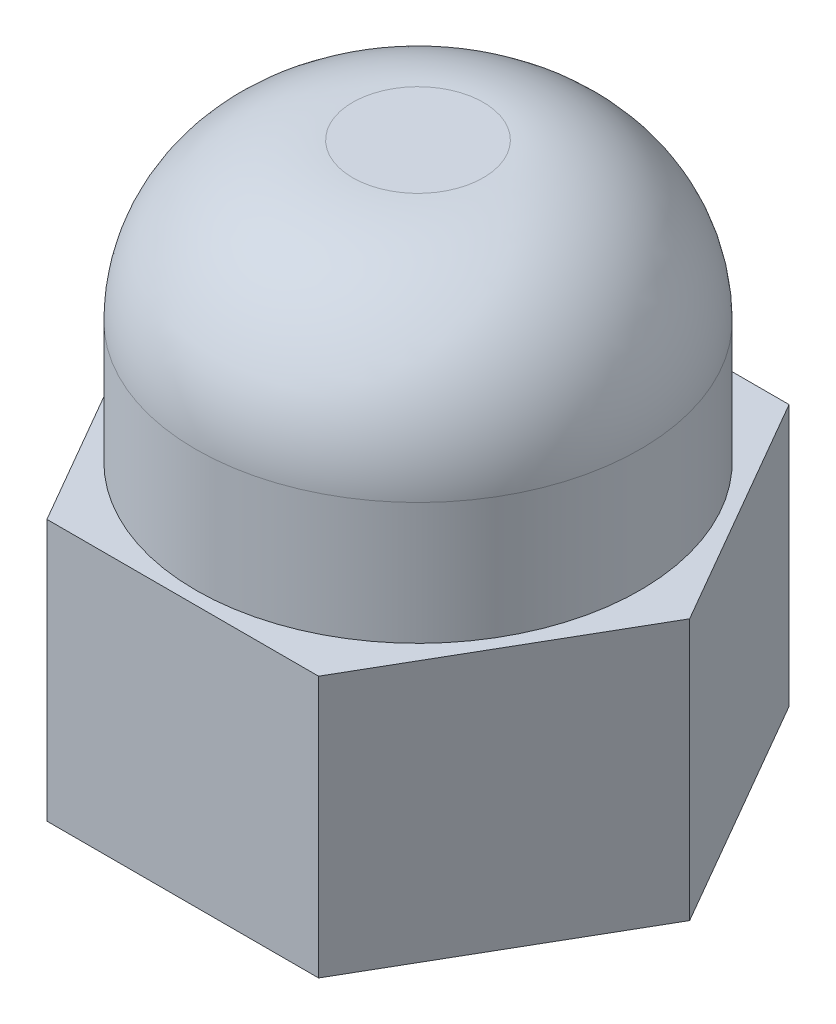
ISO-10303-21;
HEADER;
FILE_DESCRIPTION(('STEP AP214'),'2;1');
FILE_NAME('part.step','',(''),(''),'','','');
FILE_SCHEMA(('AUTOMOTIVE_DESIGN { 1 0 10303 214 1 1 1 1 }'));
ENDSEC;
DATA;
#1=APPLICATION_CONTEXT('core data for automotive mechanical design processes');
#2=APPLICATION_PROTOCOL_DEFINITION('international standard','automotive_design',2000,#1);
#3=PRODUCT_CONTEXT('',#1,'mechanical');
#4=PRODUCT('Part','Part','',(#3));
#5=PRODUCT_RELATED_PRODUCT_CATEGORY('part','',(#4));
#6=PRODUCT_DEFINITION_FORMATION('','',#4);
#7=PRODUCT_DEFINITION_CONTEXT('part definition',#1,'design');
#8=PRODUCT_DEFINITION('design','',#6,#7);
#9=PRODUCT_DEFINITION_SHAPE('','',#8);
#10=(LENGTH_UNIT() NAMED_UNIT(*) SI_UNIT(.MILLI.,.METRE.));
#11=(NAMED_UNIT(*) PLANE_ANGLE_UNIT() SI_UNIT($,.RADIAN.));
#12=(NAMED_UNIT(*) SI_UNIT($,.STERADIAN.) SOLID_ANGLE_UNIT());
#13=UNCERTAINTY_MEASURE_WITH_UNIT(LENGTH_MEASURE(1.E-05),#10,'distance_accuracy_value','');
#14=(GEOMETRIC_REPRESENTATION_CONTEXT(3) GLOBAL_UNCERTAINTY_ASSIGNED_CONTEXT((#13)) GLOBAL_UNIT_ASSIGNED_CONTEXT((#10,
#11,#12)) REPRESENTATION_CONTEXT('',''));
#15=CARTESIAN_POINT('',(0.,0.,0.));
#16=DIRECTION('',(0.,0.,1.));
#17=DIRECTION('',(1.,0.,0.));
#18=AXIS2_PLACEMENT_3D('',#15,#16,#17);
#19=CARTESIAN_POINT('',(1.55884572681202,3.,2.69999999999998));
#20=DIRECTION('',(-0.866025403784441,0.,-0.499999999999995));
#21=DIRECTION('',(-0.499999999999995,0.,0.866025403784442));
#22=AXIS2_PLACEMENT_3D('',#19,#20,#21);
#23=PLANE('',#22);
#24=DIRECTION('',(0.499999999999995,0.,-0.866025403784442));
#25=VECTOR('',#24,1.);
#26=CARTESIAN_POINT('',(1.55884572681202,0.,2.69999999999998));
#27=LINE('',#26,#25);
#28=CARTESIAN_POINT('',(1.55884572681202,0.,2.69999999999998));
#29=VERTEX_POINT('',#28);
#30=CARTESIAN_POINT('',(3.11769145362398,0.,0.));
#31=VERTEX_POINT('',#30);
#32=EDGE_CURVE('E122',#29,#31,#27,.T.);
#33=ORIENTED_EDGE('',*,*,#32,.T.);
#34=DIRECTION('',(0.,-1.,0.));
#35=VECTOR('',#34,1.);
#36=CARTESIAN_POINT('',(3.11769145362398,3.,0.));
#37=LINE('',#36,#35);
#38=CARTESIAN_POINT('',(3.11769145362398,3.,0.));
#39=VERTEX_POINT('',#38);
#40=EDGE_CURVE('E140',#39,#31,#37,.T.);
#41=ORIENTED_EDGE('',*,*,#40,.F.);
#42=DIRECTION('',(0.499999999999995,0.,-0.866025403784442));
#43=VECTOR('',#42,1.);
#44=CARTESIAN_POINT('',(1.55884572681202,3.,2.69999999999998));
#45=LINE('',#44,#43);
#46=CARTESIAN_POINT('',(1.55884572681202,3.,2.69999999999998));
#47=VERTEX_POINT('',#46);
#48=EDGE_CURVE('E133',#47,#39,#45,.T.);
#49=ORIENTED_EDGE('',*,*,#48,.F.);
#50=DIRECTION('',(0.,-1.,0.));
#51=VECTOR('',#50,1.);
#52=CARTESIAN_POINT('',(1.55884572681202,3.,2.69999999999998));
#53=LINE('',#52,#51);
#54=EDGE_CURVE('E118',#47,#29,#53,.T.);
#55=ORIENTED_EDGE('',*,*,#54,.T.);
#56=EDGE_LOOP('',(#33,#41,#49,#55));
#57=FACE_BOUND('',#56,.T.);
#58=ADVANCED_FACE('F34',(#57),#23,.F.);
#59=CARTESIAN_POINT('',(3.11769145362398,3.,0.));
#60=DIRECTION('',(-0.866025403784438,0.,0.500000000000001));
#61=DIRECTION('',(0.500000000000001,0.,0.866025403784438));
#62=AXIS2_PLACEMENT_3D('',#59,#60,#61);
#63=PLANE('',#62);
#64=DIRECTION('',(-0.500000000000001,0.,-0.866025403784438));
#65=VECTOR('',#64,1.);
#66=CARTESIAN_POINT('',(3.11769145362398,0.,0.));
#67=LINE('',#66,#65);
#68=CARTESIAN_POINT('',(1.55884572681198,0.,-2.70000000000001));
#69=VERTEX_POINT('',#68);
#70=EDGE_CURVE('E125',#31,#69,#67,.T.);
#71=ORIENTED_EDGE('',*,*,#70,.T.);
#72=DIRECTION('',(0.,-1.,0.));
#73=VECTOR('',#72,1.);
#74=CARTESIAN_POINT('',(1.55884572681198,3.,-2.70000000000001));
#75=LINE('',#74,#73);
#76=CARTESIAN_POINT('',(1.55884572681198,3.,-2.70000000000001));
#77=VERTEX_POINT('',#76);
#78=EDGE_CURVE('E137',#77,#69,#75,.T.);
#79=ORIENTED_EDGE('',*,*,#78,.F.);
#80=DIRECTION('',(-0.500000000000001,0.,-0.866025403784438));
#81=VECTOR('',#80,1.);
#82=CARTESIAN_POINT('',(3.11769145362398,3.,0.));
#83=LINE('',#82,#81);
#84=EDGE_CURVE('E90',#39,#77,#83,.T.);
#85=ORIENTED_EDGE('',*,*,#84,.F.);
#86=ORIENTED_EDGE('',*,*,#40,.T.);
#87=EDGE_LOOP('',(#71,#79,#85,#86));
#88=FACE_BOUND('',#87,.T.);
#89=ADVANCED_FACE('F155',(#88),#63,.F.);
#90=CARTESIAN_POINT('',(1.55884572681198,3.,-2.70000000000001));
#91=DIRECTION('',(0.,0.,1.));
#92=DIRECTION('',(1.,0.,0.));
#93=AXIS2_PLACEMENT_3D('',#90,#91,#92);
#94=PLANE('',#93);
#95=DIRECTION('',(-1.,0.,0.));
#96=VECTOR('',#95,1.);
#97=CARTESIAN_POINT('',(1.55884572681198,0.,-2.70000000000001));
#98=LINE('',#97,#96);
#99=CARTESIAN_POINT('',(-1.558845726812,0.,-2.69999999999999));
#100=VERTEX_POINT('',#99);
#101=EDGE_CURVE('E128',#69,#100,#98,.T.);
#102=ORIENTED_EDGE('',*,*,#101,.T.);
#103=DIRECTION('',(0.,-1.,0.));
#104=VECTOR('',#103,1.);
#105=CARTESIAN_POINT('',(-1.558845726812,3.,-2.69999999999999));
#106=LINE('',#105,#104);
#107=CARTESIAN_POINT('',(-1.558845726812,3.,-2.69999999999999));
#108=VERTEX_POINT('',#107);
#109=EDGE_CURVE('E113',#108,#100,#106,.T.);
#110=ORIENTED_EDGE('',*,*,#109,.F.);
#111=DIRECTION('',(-1.,0.,0.));
#112=VECTOR('',#111,1.);
#113=CARTESIAN_POINT('',(1.55884572681198,3.,-2.70000000000001));
#114=LINE('',#113,#112);
#115=EDGE_CURVE('E104',#77,#108,#114,.T.);
#116=ORIENTED_EDGE('',*,*,#115,.F.);
#117=ORIENTED_EDGE('',*,*,#78,.T.);
#118=EDGE_LOOP('',(#102,#110,#116,#117));
#119=FACE_BOUND('',#118,.T.);
#120=ADVANCED_FACE('F158',(#119),#94,.F.);
#121=CARTESIAN_POINT('',(-1.558845726812,3.,-2.69999999999999));
#122=DIRECTION('',(0.866025403784442,0.,0.499999999999995));
#123=DIRECTION('',(0.499999999999995,0.,-0.866025403784442));
#124=AXIS2_PLACEMENT_3D('',#121,#122,#123);
#125=PLANE('',#124);
#126=DIRECTION('',(-0.499999999999995,0.,0.866025403784441));
#127=VECTOR('',#126,1.);
#128=CARTESIAN_POINT('',(-1.558845726812,0.,-2.69999999999999));
#129=LINE('',#128,#127);
#130=CARTESIAN_POINT('',(-3.11769145362398,0.,0.));
#131=VERTEX_POINT('',#130);
#132=EDGE_CURVE('E112',#100,#131,#129,.T.);
#133=ORIENTED_EDGE('',*,*,#132,.T.);
#134=DIRECTION('',(0.,-1.,0.));
#135=VECTOR('',#134,1.);
#136=CARTESIAN_POINT('',(-3.11769145362398,3.,0.));
#137=LINE('',#136,#135);
#138=CARTESIAN_POINT('',(-3.11769145362398,3.,0.));
#139=VERTEX_POINT('',#138);
#140=EDGE_CURVE('E109',#139,#131,#137,.T.);
#141=ORIENTED_EDGE('',*,*,#140,.F.);
#142=DIRECTION('',(-0.499999999999995,0.,0.866025403784441));
#143=VECTOR('',#142,1.);
#144=CARTESIAN_POINT('',(-1.558845726812,3.,-2.69999999999999));
#145=LINE('',#144,#143);
#146=EDGE_CURVE('E98',#108,#139,#145,.T.);
#147=ORIENTED_EDGE('',*,*,#146,.F.);
#148=ORIENTED_EDGE('',*,*,#109,.T.);
#149=EDGE_LOOP('',(#133,#141,#147,#148));
#150=FACE_BOUND('',#149,.T.);
#151=ADVANCED_FACE('F110',(#150),#125,.F.);
#152=CARTESIAN_POINT('',(-3.11769145362398,3.,0.));
#153=DIRECTION('',(0.866025403784434,0.,-0.500000000000007));
#154=DIRECTION('',(-0.500000000000007,0.,-0.866025403784435));
#155=AXIS2_PLACEMENT_3D('',#152,#153,#154);
#156=PLANE('',#155);
#157=DIRECTION('',(0.500000000000007,0.,0.866025403784435));
#158=VECTOR('',#157,1.);
#159=CARTESIAN_POINT('',(-3.11769145362398,0.,0.));
#160=LINE('',#159,#158);
#161=CARTESIAN_POINT('',(-1.55884572681197,0.,2.70000000000002));
#162=VERTEX_POINT('',#161);
#163=EDGE_CURVE('E75',#131,#162,#160,.T.);
#164=ORIENTED_EDGE('',*,*,#163,.T.);
#165=DIRECTION('',(0.,-1.,0.));
#166=VECTOR('',#165,1.);
#167=CARTESIAN_POINT('',(-1.55884572681197,3.,2.70000000000002));
#168=LINE('',#167,#166);
#169=CARTESIAN_POINT('',(-1.55884572681197,3.,2.70000000000002));
#170=VERTEX_POINT('',#169);
#171=EDGE_CURVE('E114',#170,#162,#168,.T.);
#172=ORIENTED_EDGE('',*,*,#171,.F.);
#173=DIRECTION('',(0.500000000000007,0.,0.866025403784435));
#174=VECTOR('',#173,1.);
#175=CARTESIAN_POINT('',(-3.11769145362398,3.,0.));
#176=LINE('',#175,#174);
#177=EDGE_CURVE('E102',#139,#170,#176,.T.);
#178=ORIENTED_EDGE('',*,*,#177,.F.);
#179=ORIENTED_EDGE('',*,*,#140,.T.);
#180=EDGE_LOOP('',(#164,#172,#178,#179));
#181=FACE_BOUND('',#180,.T.);
#182=ADVANCED_FACE('F116',(#181),#156,.F.);
#183=CARTESIAN_POINT('',(-1.55884572681197,3.,2.70000000000002));
#184=DIRECTION('',(0.,0.,-1.));
#185=DIRECTION('',(-1.,0.,0.));
#186=AXIS2_PLACEMENT_3D('',#183,#184,#185);
#187=PLANE('',#186);
#188=DIRECTION('',(1.,0.,0.));
#189=VECTOR('',#188,1.);
#190=CARTESIAN_POINT('',(-1.55884572681197,0.,2.70000000000002));
#191=LINE('',#190,#189);
#192=EDGE_CURVE('E81',#162,#29,#191,.T.);
#193=ORIENTED_EDGE('',*,*,#192,.T.);
#194=ORIENTED_EDGE('',*,*,#54,.F.);
#195=DIRECTION('',(1.,0.,0.));
#196=VECTOR('',#195,1.);
#197=CARTESIAN_POINT('',(-1.55884572681197,3.,2.70000000000002));
#198=LINE('',#197,#196);
#199=EDGE_CURVE('E51',#170,#47,#198,.T.);
#200=ORIENTED_EDGE('',*,*,#199,.F.);
#201=ORIENTED_EDGE('',*,*,#171,.T.);
#202=EDGE_LOOP('',(#193,#194,#200,#201));
#203=FACE_BOUND('',#202,.T.);
#204=ADVANCED_FACE('F163',(#203),#187,.F.);
#205=CARTESIAN_POINT('',(0.,3.,0.));
#206=DIRECTION('',(0.,1.,0.));
#207=DIRECTION('',(0.,0.,1.));
#208=AXIS2_PLACEMENT_3D('',#205,#206,#207);
#209=PLANE('',#208);
#210=CARTESIAN_POINT('',(0.,3.,0.));
#211=DIRECTION('',(0.,1.,0.));
#212=DIRECTION('',(0.,0.,1.));
#213=AXIS2_PLACEMENT_3D('',#210,#211,#212);
#214=CIRCLE('',#213,2.55);
#215=CARTESIAN_POINT('',(0.,3.,2.55));
#216=VERTEX_POINT('',#215);
#217=EDGE_CURVE('E141',#216,#216,#214,.T.);
#218=ORIENTED_EDGE('',*,*,#217,.F.);
#219=EDGE_LOOP('',(#218));
#220=FACE_BOUND('',#219,.T.);
#221=ORIENTED_EDGE('',*,*,#48,.T.);
#222=ORIENTED_EDGE('',*,*,#84,.T.);
#223=ORIENTED_EDGE('',*,*,#115,.T.);
#224=ORIENTED_EDGE('',*,*,#146,.T.);
#225=ORIENTED_EDGE('',*,*,#177,.T.);
#226=ORIENTED_EDGE('',*,*,#199,.T.);
#227=EDGE_LOOP('',(#221,#222,#223,#224,#225,#226));
#228=FACE_BOUND('',#227,.T.);
#229=ADVANCED_FACE('F100',(#220,#228),#209,.T.);
#230=CARTESIAN_POINT('',(0.,0.,0.));
#231=DIRECTION('',(0.,1.,0.));
#232=DIRECTION('',(0.,0.,1.));
#233=AXIS2_PLACEMENT_3D('',#230,#231,#232);
#234=PLANE('',#233);
#235=CARTESIAN_POINT('',(0.,0.,0.));
#236=DIRECTION('',(0.,-1.,0.));
#237=DIRECTION('',(0.,0.,-1.));
#238=AXIS2_PLACEMENT_3D('',#235,#236,#237);
#239=CIRCLE('',#238,1.69999999999999);
#240=CARTESIAN_POINT('',(0.,0.,-1.69999999999999));
#241=VERTEX_POINT('',#240);
#242=EDGE_CURVE('E265',#241,#241,#239,.T.);
#243=ORIENTED_EDGE('',*,*,#242,.F.);
#244=EDGE_LOOP('',(#243));
#245=FACE_BOUND('',#244,.T.);
#246=ORIENTED_EDGE('',*,*,#32,.F.);
#247=ORIENTED_EDGE('',*,*,#192,.F.);
#248=ORIENTED_EDGE('',*,*,#163,.F.);
#249=ORIENTED_EDGE('',*,*,#132,.F.);
#250=ORIENTED_EDGE('',*,*,#101,.F.);
#251=ORIENTED_EDGE('',*,*,#70,.F.);
#252=EDGE_LOOP('',(#246,#247,#248,#249,#250,#251));
#253=FACE_BOUND('',#252,.T.);
#254=ADVANCED_FACE('F161',(#245,#253),#234,.F.);
#255=CARTESIAN_POINT('',(0.,6.2,0.));
#256=DIRECTION('',(0.,-1.,0.));
#257=DIRECTION('',(0.,0.,-1.));
#258=AXIS2_PLACEMENT_3D('',#255,#256,#257);
#259=CYLINDRICAL_SURFACE('',#258,2.55);
#260=CARTESIAN_POINT('',(0.,4.4,0.));
#261=DIRECTION('',(0.,1.,0.));
#262=DIRECTION('',(0.,0.,1.));
#263=AXIS2_PLACEMENT_3D('',#260,#261,#262);
#264=CIRCLE('',#263,2.55);
#265=CARTESIAN_POINT('',(0.,4.4,2.55));
#266=VERTEX_POINT('',#265);
#267=EDGE_CURVE('E11',#266,#266,#264,.F.);
#268=ORIENTED_EDGE('',*,*,#267,.T.);
#269=EDGE_LOOP('',(#268));
#270=FACE_BOUND('',#269,.T.);
#271=ORIENTED_EDGE('',*,*,#217,.T.);
#272=EDGE_LOOP('',(#271));
#273=FACE_BOUND('',#272,.T.);
#274=ADVANCED_FACE('F208',(#270,#273),#259,.T.);
#275=CARTESIAN_POINT('',(0.,6.2,0.));
#276=DIRECTION('',(0.,1.,0.));
#277=DIRECTION('',(0.,0.,1.));
#278=AXIS2_PLACEMENT_3D('',#275,#276,#277);
#279=PLANE('',#278);
#280=CARTESIAN_POINT('',(0.,6.2,0.));
#281=DIRECTION('',(0.,1.,0.));
#282=DIRECTION('',(0.,0.,1.));
#283=AXIS2_PLACEMENT_3D('',#280,#281,#282);
#284=CIRCLE('',#283,0.75);
#285=CARTESIAN_POINT('',(0.,6.2,0.75));
#286=VERTEX_POINT('',#285);
#287=EDGE_CURVE('E43',#286,#286,#284,.T.);
#288=ORIENTED_EDGE('',*,*,#287,.T.);
#289=EDGE_LOOP('',(#288));
#290=FACE_BOUND('',#289,.T.);
#291=ADVANCED_FACE('F213',(#290),#279,.T.);
#292=CARTESIAN_POINT('',(0.,4.4,0.));
#293=DIRECTION('',(0.,1.,0.));
#294=DIRECTION('',(0.,0.,1.));
#295=AXIS2_PLACEMENT_3D('',#292,#293,#294);
#296=DEGENERATE_TOROIDAL_SURFACE('',#295,0.75,1.8,.T.);
#297=ORIENTED_EDGE('',*,*,#267,.F.);
#298=EDGE_LOOP('',(#297));
#299=FACE_BOUND('',#298,.T.);
#300=ORIENTED_EDGE('',*,*,#287,.F.);
#301=EDGE_LOOP('',(#300));
#302=FACE_BOUND('',#301,.T.);
#303=ADVANCED_FACE('F36',(#299,#302),#296,.T.);
#304=CARTESIAN_POINT('',(0.,5.,0.));
#305=DIRECTION('',(0.,-1.,0.));
#306=DIRECTION('',(0.,0.,-1.));
#307=AXIS2_PLACEMENT_3D('',#304,#305,#306);
#308=CONICAL_SURFACE('',#307,1.69999999999999,1.02974425867665);
#309=CARTESIAN_POINT('',(0.,6.02146305234685,0.));
#310=VERTEX_POINT('',#309);
#311=VERTEX_LOOP('',#310);
#312=FACE_BOUND('',#311,.T.);
#313=CARTESIAN_POINT('',(0.,5.,0.));
#314=DIRECTION('',(0.,-1.,0.));
#315=DIRECTION('',(0.,0.,-1.));
#316=AXIS2_PLACEMENT_3D('',#313,#314,#315);
#317=CIRCLE('',#316,1.69999999999999);
#318=CARTESIAN_POINT('',(0.,5.,-1.69999999999999));
#319=VERTEX_POINT('',#318);
#320=EDGE_CURVE('E126',#319,#319,#317,.T.);
#321=ORIENTED_EDGE('',*,*,#320,.T.);
#322=EDGE_LOOP('',(#321));
#323=FACE_BOUND('',#322,.T.);
#324=ADVANCED_FACE('F231',(#312,#323),#308,.F.);
#325=CARTESIAN_POINT('',(0.,0.,0.));
#326=DIRECTION('',(0.,-1.,0.));
#327=DIRECTION('',(0.,0.,-1.));
#328=AXIS2_PLACEMENT_3D('',#325,#326,#327);
#329=CYLINDRICAL_SURFACE('',#328,1.69999999999999);
#330=ORIENTED_EDGE('',*,*,#320,.F.);
#331=EDGE_LOOP('',(#330));
#332=FACE_BOUND('',#331,.T.);
#333=ORIENTED_EDGE('',*,*,#242,.T.);
#334=EDGE_LOOP('',(#333));
#335=FACE_BOUND('',#334,.T.);
#336=ADVANCED_FACE('F246',(#332,#335),#329,.F.);
#337=CLOSED_SHELL('',(#58,#89,#120,#151,#182,#204,#229,#254,#274,#291,#303,#324,#336));
#338=MANIFOLD_SOLID_BREP('B2',#337);
#339=ADVANCED_BREP_SHAPE_REPRESENTATION('',(#18,#338),#14);
#340=SHAPE_DEFINITION_REPRESENTATION(#9,#339);
ENDSEC;
END-ISO-10303-21;
